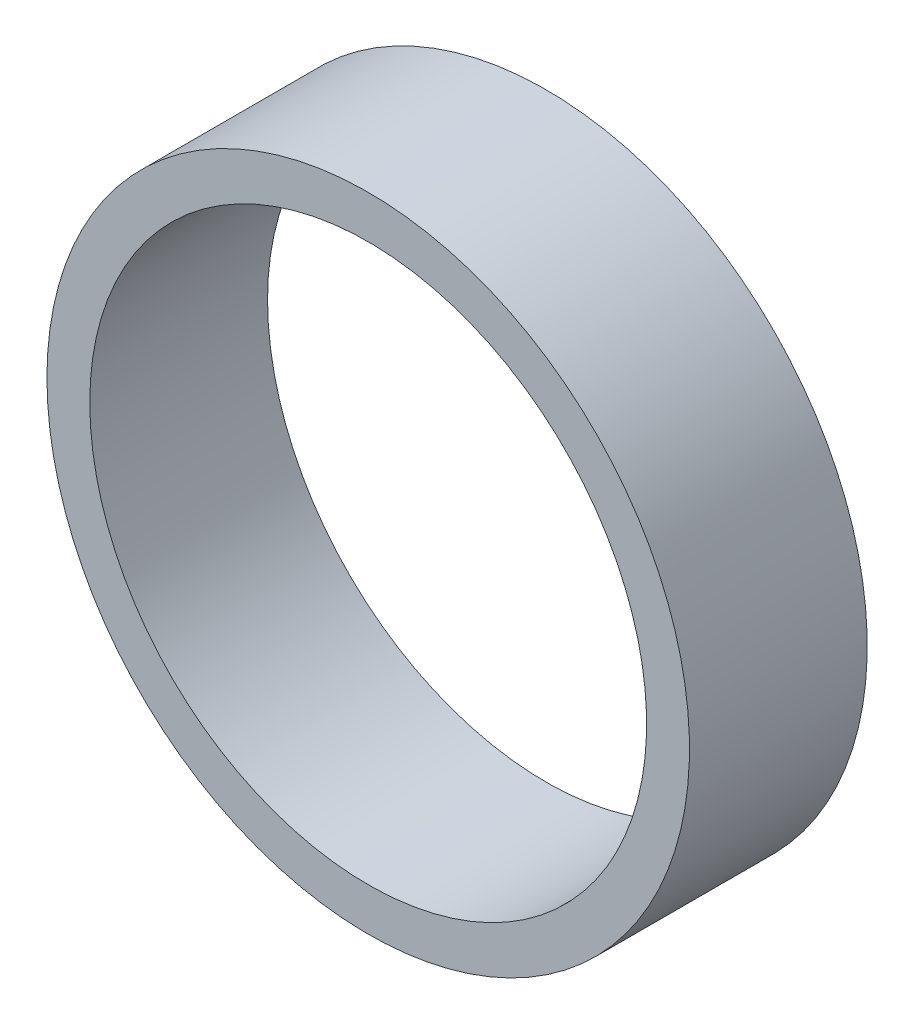
ISO-10303-21;
HEADER;
FILE_DESCRIPTION(('STEP AP214'),'2;1');
FILE_NAME('part.step','',(''),(''),'','','');
FILE_SCHEMA(('AUTOMOTIVE_DESIGN { 1 0 10303 214 1 1 1 1 }'));
ENDSEC;
DATA;
#1=APPLICATION_CONTEXT('core data for automotive mechanical design processes');
#2=APPLICATION_PROTOCOL_DEFINITION('international standard','automotive_design',2000,#1);
#3=PRODUCT_CONTEXT('',#1,'mechanical');
#4=PRODUCT('Part','Part','',(#3));
#5=PRODUCT_RELATED_PRODUCT_CATEGORY('part','',(#4));
#6=PRODUCT_DEFINITION_FORMATION('','',#4);
#7=PRODUCT_DEFINITION_CONTEXT('part definition',#1,'design');
#8=PRODUCT_DEFINITION('design','',#6,#7);
#9=PRODUCT_DEFINITION_SHAPE('','',#8);
#10=(LENGTH_UNIT() NAMED_UNIT(*) SI_UNIT(.MILLI.,.METRE.));
#11=(NAMED_UNIT(*) PLANE_ANGLE_UNIT() SI_UNIT($,.RADIAN.));
#12=(NAMED_UNIT(*) SI_UNIT($,.STERADIAN.) SOLID_ANGLE_UNIT());
#13=UNCERTAINTY_MEASURE_WITH_UNIT(LENGTH_MEASURE(1.E-05),#10,'distance_accuracy_value','');
#14=(GEOMETRIC_REPRESENTATION_CONTEXT(3) GLOBAL_UNCERTAINTY_ASSIGNED_CONTEXT((#13)) GLOBAL_UNIT_ASSIGNED_CONTEXT((#10,
#11,#12)) REPRESENTATION_CONTEXT('',''));
#15=CARTESIAN_POINT('',(0.,0.,0.));
#16=DIRECTION('',(0.,0.,1.));
#17=DIRECTION('',(1.,0.,0.));
#18=AXIS2_PLACEMENT_3D('',#15,#16,#17);
#19=CARTESIAN_POINT('',(0.,0.,4.15));
#20=DIRECTION('',(0.,0.,1.));
#21=DIRECTION('',(1.,0.,0.));
#22=AXIS2_PLACEMENT_3D('',#19,#20,#21);
#23=PLANE('',#22);
#24=CARTESIAN_POINT('',(0.,0.,4.15));
#25=DIRECTION('',(0.,0.,1.));
#26=DIRECTION('',(1.,0.,0.));
#27=AXIS2_PLACEMENT_3D('',#24,#25,#26);
#28=CIRCLE('',#27,7.5);
#29=CARTESIAN_POINT('',(-7.5,0.,4.15));
#30=VERTEX_POINT('',#29);
#31=EDGE_CURVE('E10',#30,#30,#28,.T.);
#32=ORIENTED_EDGE('',*,*,#31,.T.);
#33=EDGE_LOOP('',(#32));
#34=FACE_BOUND('',#33,.T.);
#35=CARTESIAN_POINT('',(0.,0.,4.15));
#36=DIRECTION('',(0.,0.,1.));
#37=DIRECTION('',(1.,0.,0.));
#38=AXIS2_PLACEMENT_3D('',#35,#36,#37);
#39=CIRCLE('',#38,6.5);
#40=CARTESIAN_POINT('',(-6.5,0.,4.15));
#41=VERTEX_POINT('',#40);
#42=EDGE_CURVE('E42',#41,#41,#39,.T.);
#43=ORIENTED_EDGE('',*,*,#42,.F.);
#44=EDGE_LOOP('',(#43));
#45=FACE_BOUND('',#44,.T.);
#46=ADVANCED_FACE('F31',(#34,#45),#23,.T.);
#47=CARTESIAN_POINT('',(0.,0.,0.));
#48=DIRECTION('',(0.,0.,1.));
#49=DIRECTION('',(1.,0.,0.));
#50=AXIS2_PLACEMENT_3D('',#47,#48,#49);
#51=PLANE('',#50);
#52=CARTESIAN_POINT('',(0.,0.,0.));
#53=DIRECTION('',(0.,0.,1.));
#54=DIRECTION('',(1.,0.,0.));
#55=AXIS2_PLACEMENT_3D('',#52,#53,#54);
#56=CIRCLE('',#55,7.5);
#57=CARTESIAN_POINT('',(-7.5,0.,0.));
#58=VERTEX_POINT('',#57);
#59=EDGE_CURVE('E35',#58,#58,#56,.T.);
#60=ORIENTED_EDGE('',*,*,#59,.F.);
#61=EDGE_LOOP('',(#60));
#62=FACE_BOUND('',#61,.T.);
#63=CARTESIAN_POINT('',(0.,0.,0.));
#64=DIRECTION('',(0.,0.,1.));
#65=DIRECTION('',(1.,0.,0.));
#66=AXIS2_PLACEMENT_3D('',#63,#64,#65);
#67=CIRCLE('',#66,6.5);
#68=CARTESIAN_POINT('',(-6.5,0.,0.));
#69=VERTEX_POINT('',#68);
#70=EDGE_CURVE('E44',#69,#69,#67,.T.);
#71=ORIENTED_EDGE('',*,*,#70,.T.);
#72=EDGE_LOOP('',(#71));
#73=FACE_BOUND('',#72,.T.);
#74=ADVANCED_FACE('F54',(#62,#73),#51,.F.);
#75=CARTESIAN_POINT('',(0.,0.,4.15));
#76=DIRECTION('',(0.,0.,-1.));
#77=DIRECTION('',(-1.,0.,0.));
#78=AXIS2_PLACEMENT_3D('',#75,#76,#77);
#79=CYLINDRICAL_SURFACE('',#78,7.5);
#80=CARTESIAN_POINT('',(-7.5,0.,4.15));
#81=CARTESIAN_POINT('',(-7.5,0.,4.10677083333333));
#82=CARTESIAN_POINT('',(-7.5,0.,4.06354166666667));
#83=CARTESIAN_POINT('',(-7.5,0.,3.97708333333333));
#84=CARTESIAN_POINT('',(-7.5,0.,3.93385416666667));
#85=CARTESIAN_POINT('',(-7.5,0.,3.84739583333333));
#86=CARTESIAN_POINT('',(-7.5,0.,3.80416666666667));
#87=CARTESIAN_POINT('',(-7.5,0.,3.71770833333333));
#88=CARTESIAN_POINT('',(-7.5,0.,3.67447916666667));
#89=CARTESIAN_POINT('',(-7.5,0.,3.58802083333333));
#90=CARTESIAN_POINT('',(-7.5,0.,3.54479166666667));
#91=CARTESIAN_POINT('',(-7.5,0.,3.45833333333333));
#92=CARTESIAN_POINT('',(-7.5,0.,3.41510416666667));
#93=CARTESIAN_POINT('',(-7.5,0.,3.32864583333333));
#94=CARTESIAN_POINT('',(-7.5,0.,3.28541666666667));
#95=CARTESIAN_POINT('',(-7.5,0.,3.19895833333333));
#96=CARTESIAN_POINT('',(-7.5,0.,3.15572916666667));
#97=CARTESIAN_POINT('',(-7.5,0.,3.06927083333333));
#98=CARTESIAN_POINT('',(-7.5,0.,3.02604166666667));
#99=CARTESIAN_POINT('',(-7.5,0.,2.93958333333333));
#100=CARTESIAN_POINT('',(-7.5,0.,2.89635416666667));
#101=CARTESIAN_POINT('',(-7.5,0.,2.80989583333333));
#102=CARTESIAN_POINT('',(-7.5,0.,2.76666666666667));
#103=CARTESIAN_POINT('',(-7.5,0.,2.68020833333333));
#104=CARTESIAN_POINT('',(-7.5,0.,2.63697916666667));
#105=CARTESIAN_POINT('',(-7.5,0.,2.55052083333333));
#106=CARTESIAN_POINT('',(-7.5,0.,2.50729166666667));
#107=CARTESIAN_POINT('',(-7.5,0.,2.42083333333333));
#108=CARTESIAN_POINT('',(-7.5,0.,2.37760416666667));
#109=CARTESIAN_POINT('',(-7.5,0.,2.29114583333333));
#110=CARTESIAN_POINT('',(-7.5,0.,2.24791666666667));
#111=CARTESIAN_POINT('',(-7.5,0.,2.16145833333333));
#112=CARTESIAN_POINT('',(-7.5,0.,2.11822916666667));
#113=CARTESIAN_POINT('',(-7.5,0.,2.03177083333333));
#114=CARTESIAN_POINT('',(-7.5,0.,1.98854166666667));
#115=CARTESIAN_POINT('',(-7.5,0.,1.90208333333333));
#116=CARTESIAN_POINT('',(-7.5,0.,1.85885416666667));
#117=CARTESIAN_POINT('',(-7.5,0.,1.77239583333333));
#118=CARTESIAN_POINT('',(-7.5,0.,1.72916666666667));
#119=CARTESIAN_POINT('',(-7.5,0.,1.64270833333333));
#120=CARTESIAN_POINT('',(-7.5,0.,1.59947916666667));
#121=CARTESIAN_POINT('',(-7.5,0.,1.51302083333333));
#122=CARTESIAN_POINT('',(-7.5,0.,1.46979166666667));
#123=CARTESIAN_POINT('',(-7.5,0.,1.38333333333333));
#124=CARTESIAN_POINT('',(-7.5,0.,1.34010416666667));
#125=CARTESIAN_POINT('',(-7.5,0.,1.25364583333333));
#126=CARTESIAN_POINT('',(-7.5,0.,1.21041666666667));
#127=CARTESIAN_POINT('',(-7.5,0.,1.12395833333333));
#128=CARTESIAN_POINT('',(-7.5,0.,1.08072916666667));
#129=CARTESIAN_POINT('',(-7.5,0.,0.994270833333334));
#130=CARTESIAN_POINT('',(-7.5,0.,0.951041666666667));
#131=CARTESIAN_POINT('',(-7.5,0.,0.864583333333333));
#132=CARTESIAN_POINT('',(-7.5,0.,0.821354166666667));
#133=CARTESIAN_POINT('',(-7.5,0.,0.734895833333334));
#134=CARTESIAN_POINT('',(-7.5,0.,0.691666666666667));
#135=CARTESIAN_POINT('',(-7.5,0.,0.605208333333333));
#136=CARTESIAN_POINT('',(-7.5,0.,0.561979166666667));
#137=CARTESIAN_POINT('',(-7.5,0.,0.475520833333333));
#138=CARTESIAN_POINT('',(-7.5,0.,0.432291666666667));
#139=CARTESIAN_POINT('',(-7.5,0.,0.345833333333333));
#140=CARTESIAN_POINT('',(-7.5,0.,0.302604166666667));
#141=CARTESIAN_POINT('',(-7.5,0.,0.216145833333333));
#142=CARTESIAN_POINT('',(-7.5,0.,0.172916666666666));
#143=CARTESIAN_POINT('',(-7.5,0.,0.0864583333333331));
#144=CARTESIAN_POINT('',(-7.5,0.,0.0432291666666665));
#145=CARTESIAN_POINT('',(-7.5,0.,0.));
#146=B_SPLINE_CURVE_WITH_KNOTS('',3,(#80,#81,#82,#83,#84,#85,#86,#87,#88,#89,#90,#91,#92,#93,
#94,#95,#96,#97,#98,#99,#100,#101,#102,#103,#104,#105,#106,#107,#108,#109,#110,#111,#112,#113,
#114,#115,#116,#117,#118,#119,#120,#121,#122,#123,#124,#125,#126,#127,#128,#129,#130,#131,#132,
#133,#134,#135,#136,#137,#138,#139,#140,#141,#142,#143,#144,#145),.UNSPECIFIED.,.F.,.F.,(4,2,2,
2,2,2,2,2,2,2,2,2,2,2,2,2,2,2,2,2,2,2,2,2,2,2,2,2,2,2,2,2,4),(0.,0.1296875,0.259375,0.3890625,
0.518749999999999,0.6484375,0.778124999999999,0.907812499999999,1.0375,1.1671875,1.296875,
1.4265625,1.55625,1.6859375,1.815625,1.9453125,2.075,2.2046875,2.334375,2.4640625,2.59375,
2.7234375,2.853125,2.9828125,3.1125,3.2421875,3.371875,3.5015625,3.63125,3.7609375,3.890625,
4.0203125,4.15),.UNSPECIFIED.);
#147=EDGE_CURVE('BSEAM33',#30,#58,#146,.T.);
#148=ORIENTED_EDGE('',*,*,#31,.F.);
#149=ORIENTED_EDGE('',*,*,#59,.T.);
#150=ORIENTED_EDGE('',*,*,#147,.T.);
#151=ORIENTED_EDGE('',*,*,#147,.F.);
#152=EDGE_LOOP('',(#148,#150,#149,#151));
#153=FACE_BOUND('',#152,.T.);
#154=ADVANCED_FACE('F33',(#153),#79,.T.);
#155=CARTESIAN_POINT('',(0.,0.,4.15));
#156=DIRECTION('',(0.,0.,-1.));
#157=DIRECTION('',(-1.,0.,0.));
#158=AXIS2_PLACEMENT_3D('',#155,#156,#157);
#159=CYLINDRICAL_SURFACE('',#158,6.5);
#160=CARTESIAN_POINT('',(-6.5,0.,4.15));
#161=CARTESIAN_POINT('',(-6.5,0.,4.10677083333333));
#162=CARTESIAN_POINT('',(-6.5,0.,4.06354166666667));
#163=CARTESIAN_POINT('',(-6.5,0.,3.97708333333333));
#164=CARTESIAN_POINT('',(-6.5,0.,3.93385416666667));
#165=CARTESIAN_POINT('',(-6.5,0.,3.84739583333333));
#166=CARTESIAN_POINT('',(-6.5,0.,3.80416666666667));
#167=CARTESIAN_POINT('',(-6.5,0.,3.71770833333333));
#168=CARTESIAN_POINT('',(-6.5,0.,3.67447916666667));
#169=CARTESIAN_POINT('',(-6.5,0.,3.58802083333333));
#170=CARTESIAN_POINT('',(-6.5,0.,3.54479166666667));
#171=CARTESIAN_POINT('',(-6.5,0.,3.45833333333333));
#172=CARTESIAN_POINT('',(-6.5,0.,3.41510416666667));
#173=CARTESIAN_POINT('',(-6.5,0.,3.32864583333333));
#174=CARTESIAN_POINT('',(-6.5,0.,3.28541666666667));
#175=CARTESIAN_POINT('',(-6.5,0.,3.19895833333333));
#176=CARTESIAN_POINT('',(-6.5,0.,3.15572916666667));
#177=CARTESIAN_POINT('',(-6.5,0.,3.06927083333333));
#178=CARTESIAN_POINT('',(-6.5,0.,3.02604166666667));
#179=CARTESIAN_POINT('',(-6.5,0.,2.93958333333333));
#180=CARTESIAN_POINT('',(-6.5,0.,2.89635416666667));
#181=CARTESIAN_POINT('',(-6.5,0.,2.80989583333333));
#182=CARTESIAN_POINT('',(-6.5,0.,2.76666666666667));
#183=CARTESIAN_POINT('',(-6.5,0.,2.68020833333333));
#184=CARTESIAN_POINT('',(-6.5,0.,2.63697916666667));
#185=CARTESIAN_POINT('',(-6.5,0.,2.55052083333333));
#186=CARTESIAN_POINT('',(-6.5,0.,2.50729166666667));
#187=CARTESIAN_POINT('',(-6.5,0.,2.42083333333333));
#188=CARTESIAN_POINT('',(-6.5,0.,2.37760416666667));
#189=CARTESIAN_POINT('',(-6.5,0.,2.29114583333333));
#190=CARTESIAN_POINT('',(-6.5,0.,2.24791666666667));
#191=CARTESIAN_POINT('',(-6.5,0.,2.16145833333333));
#192=CARTESIAN_POINT('',(-6.5,0.,2.11822916666667));
#193=CARTESIAN_POINT('',(-6.5,0.,2.03177083333333));
#194=CARTESIAN_POINT('',(-6.5,0.,1.98854166666667));
#195=CARTESIAN_POINT('',(-6.5,0.,1.90208333333333));
#196=CARTESIAN_POINT('',(-6.5,0.,1.85885416666667));
#197=CARTESIAN_POINT('',(-6.5,0.,1.77239583333333));
#198=CARTESIAN_POINT('',(-6.5,0.,1.72916666666667));
#199=CARTESIAN_POINT('',(-6.5,0.,1.64270833333333));
#200=CARTESIAN_POINT('',(-6.5,0.,1.59947916666667));
#201=CARTESIAN_POINT('',(-6.5,0.,1.51302083333333));
#202=CARTESIAN_POINT('',(-6.5,0.,1.46979166666667));
#203=CARTESIAN_POINT('',(-6.5,0.,1.38333333333333));
#204=CARTESIAN_POINT('',(-6.5,0.,1.34010416666667));
#205=CARTESIAN_POINT('',(-6.5,0.,1.25364583333333));
#206=CARTESIAN_POINT('',(-6.5,0.,1.21041666666667));
#207=CARTESIAN_POINT('',(-6.5,0.,1.12395833333333));
#208=CARTESIAN_POINT('',(-6.5,0.,1.08072916666667));
#209=CARTESIAN_POINT('',(-6.5,0.,0.994270833333334));
#210=CARTESIAN_POINT('',(-6.5,0.,0.951041666666667));
#211=CARTESIAN_POINT('',(-6.5,0.,0.864583333333333));
#212=CARTESIAN_POINT('',(-6.5,0.,0.821354166666667));
#213=CARTESIAN_POINT('',(-6.5,0.,0.734895833333334));
#214=CARTESIAN_POINT('',(-6.5,0.,0.691666666666667));
#215=CARTESIAN_POINT('',(-6.5,0.,0.605208333333333));
#216=CARTESIAN_POINT('',(-6.5,0.,0.561979166666667));
#217=CARTESIAN_POINT('',(-6.5,0.,0.475520833333333));
#218=CARTESIAN_POINT('',(-6.5,0.,0.432291666666667));
#219=CARTESIAN_POINT('',(-6.5,0.,0.345833333333333));
#220=CARTESIAN_POINT('',(-6.5,0.,0.302604166666667));
#221=CARTESIAN_POINT('',(-6.5,0.,0.216145833333333));
#222=CARTESIAN_POINT('',(-6.5,0.,0.172916666666666));
#223=CARTESIAN_POINT('',(-6.5,0.,0.0864583333333331));
#224=CARTESIAN_POINT('',(-6.5,0.,0.0432291666666665));
#225=CARTESIAN_POINT('',(-6.5,0.,0.));
#226=B_SPLINE_CURVE_WITH_KNOTS('',3,(#160,#161,#162,#163,#164,#165,#166,#167,#168,#169,#170,
#171,#172,#173,#174,#175,#176,#177,#178,#179,#180,#181,#182,#183,#184,#185,#186,#187,#188,#189,
#190,#191,#192,#193,#194,#195,#196,#197,#198,#199,#200,#201,#202,#203,#204,#205,#206,#207,#208,
#209,#210,#211,#212,#213,#214,#215,#216,#217,#218,#219,#220,#221,#222,#223,#224,#225),
.UNSPECIFIED.,.F.,.F.,(4,2,2,2,2,2,2,2,2,2,2,2,2,2,2,2,2,2,2,2,2,2,2,2,2,2,2,2,2,2,2,2,4),(0.,
0.1296875,0.259375,0.3890625,0.518749999999999,0.6484375,0.778124999999999,0.907812499999999,
1.0375,1.1671875,1.296875,1.4265625,1.55625,1.6859375,1.815625,1.9453125,2.075,2.2046875,
2.334375,2.4640625,2.59375,2.7234375,2.853125,2.9828125,3.1125,3.2421875,3.371875,3.5015625,
3.63125,3.7609375,3.890625,4.0203125,4.15),.UNSPECIFIED.);
#227=EDGE_CURVE('BSEAM50',#41,#69,#226,.T.);
#228=ORIENTED_EDGE('',*,*,#42,.T.);
#229=ORIENTED_EDGE('',*,*,#70,.F.);
#230=ORIENTED_EDGE('',*,*,#227,.T.);
#231=ORIENTED_EDGE('',*,*,#227,.F.);
#232=EDGE_LOOP('',(#228,#230,#229,#231));
#233=FACE_BOUND('',#232,.T.);
#234=ADVANCED_FACE('F50',(#233),#159,.F.);
#235=CLOSED_SHELL('',(#46,#74,#154,#234));
#236=MANIFOLD_SOLID_BREP('B2',#235);
#237=ADVANCED_BREP_SHAPE_REPRESENTATION('',(#18,#236),#14);
#238=SHAPE_DEFINITION_REPRESENTATION(#9,#237);
ENDSEC;
END-ISO-10303-21;
